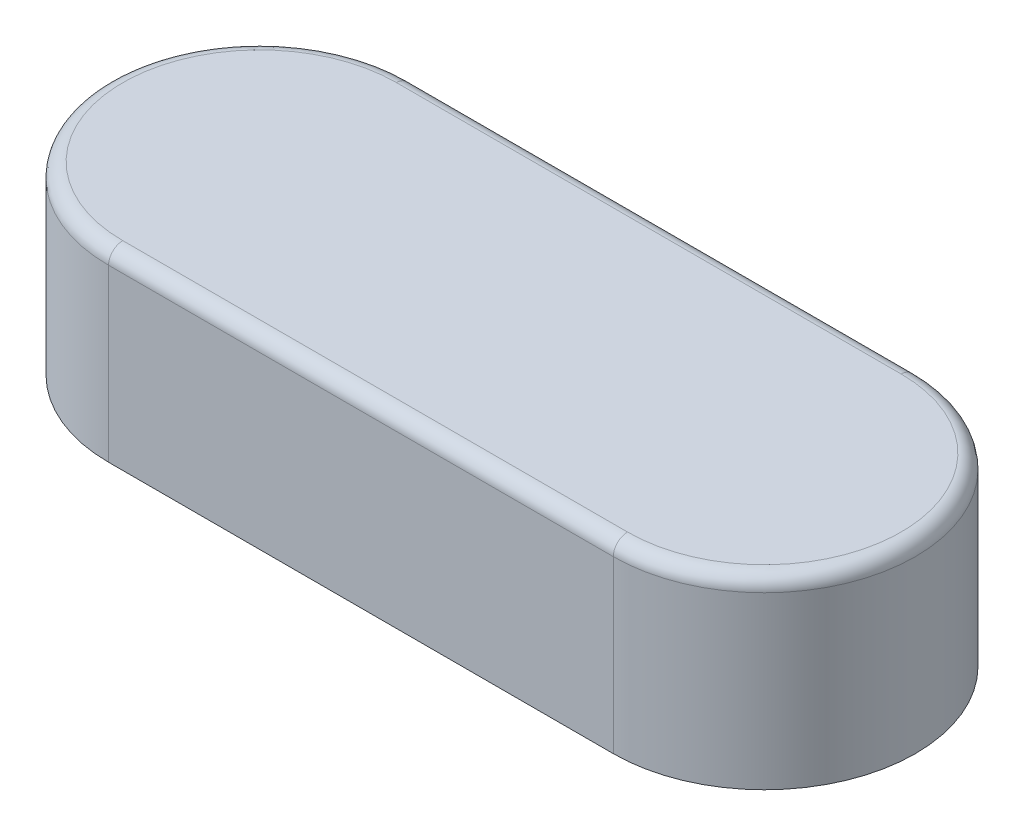
ISO-10303-21;
HEADER;
FILE_DESCRIPTION(('STEP AP214'),'2;1');
FILE_NAME('part.step','',(''),(''),'','','');
FILE_SCHEMA(('AUTOMOTIVE_DESIGN { 1 0 10303 214 1 1 1 1 }'));
ENDSEC;
DATA;
#1=APPLICATION_CONTEXT('core data for automotive mechanical design processes');
#2=APPLICATION_PROTOCOL_DEFINITION('international standard','automotive_design',2000,#1);
#3=PRODUCT_CONTEXT('',#1,'mechanical');
#4=PRODUCT('Part','Part','',(#3));
#5=PRODUCT_RELATED_PRODUCT_CATEGORY('part','',(#4));
#6=PRODUCT_DEFINITION_FORMATION('','',#4);
#7=PRODUCT_DEFINITION_CONTEXT('part definition',#1,'design');
#8=PRODUCT_DEFINITION('design','',#6,#7);
#9=PRODUCT_DEFINITION_SHAPE('','',#8);
#10=(LENGTH_UNIT() NAMED_UNIT(*) SI_UNIT(.MILLI.,.METRE.));
#11=(NAMED_UNIT(*) PLANE_ANGLE_UNIT() SI_UNIT($,.RADIAN.));
#12=(NAMED_UNIT(*) SI_UNIT($,.STERADIAN.) SOLID_ANGLE_UNIT());
#13=UNCERTAINTY_MEASURE_WITH_UNIT(LENGTH_MEASURE(1.E-05),#10,'distance_accuracy_value','');
#14=(GEOMETRIC_REPRESENTATION_CONTEXT(3) GLOBAL_UNCERTAINTY_ASSIGNED_CONTEXT((#13)) GLOBAL_UNIT_ASSIGNED_CONTEXT((#10,
#11,#12)) REPRESENTATION_CONTEXT('',''));
#15=CARTESIAN_POINT('',(0.,0.,0.));
#16=DIRECTION('',(0.,0.,1.));
#17=DIRECTION('',(1.,0.,0.));
#18=AXIS2_PLACEMENT_3D('',#15,#16,#17);
#19=CARTESIAN_POINT('',(0.,-15.,0.));
#20=DIRECTION('',(0.,1.,0.));
#21=DIRECTION('',(0.,0.,1.));
#22=AXIS2_PLACEMENT_3D('',#19,#20,#21);
#23=PLANE('',#22);
#24=CARTESIAN_POINT('',(0.,-15.,-37.5));
#25=DIRECTION('',(0.,1.,0.));
#26=DIRECTION('',(0.,0.,1.));
#27=AXIS2_PLACEMENT_3D('',#24,#25,#26);
#28=CIRCLE('',#27,2.1);
#29=CARTESIAN_POINT('',(0.,-15.,-35.4));
#30=VERTEX_POINT('',#29);
#31=EDGE_CURVE('E374',#30,#30,#28,.F.);
#32=ORIENTED_EDGE('',*,*,#31,.F.);
#33=EDGE_LOOP('',(#32));
#34=FACE_BOUND('',#33,.T.);
#35=CARTESIAN_POINT('',(37.5,-15.,0.));
#36=DIRECTION('',(0.,1.,0.));
#37=DIRECTION('',(0.,0.,1.));
#38=AXIS2_PLACEMENT_3D('',#35,#36,#37);
#39=CIRCLE('',#38,2.1);
#40=CARTESIAN_POINT('',(37.5,-15.,2.1));
#41=VERTEX_POINT('',#40);
#42=EDGE_CURVE('E403',#41,#41,#39,.F.);
#43=ORIENTED_EDGE('',*,*,#42,.F.);
#44=EDGE_LOOP('',(#43));
#45=FACE_BOUND('',#44,.T.);
#46=CARTESIAN_POINT('',(0.,-15.,37.5));
#47=DIRECTION('',(0.,1.,0.));
#48=DIRECTION('',(0.,0.,1.));
#49=AXIS2_PLACEMENT_3D('',#46,#47,#48);
#50=CIRCLE('',#49,2.1);
#51=CARTESIAN_POINT('',(0.,-15.,39.6));
#52=VERTEX_POINT('',#51);
#53=EDGE_CURVE('E400',#52,#52,#50,.F.);
#54=ORIENTED_EDGE('',*,*,#53,.F.);
#55=EDGE_LOOP('',(#54));
#56=FACE_BOUND('',#55,.T.);
#57=CARTESIAN_POINT('',(-142.,-15.,37.5));
#58=DIRECTION('',(0.,1.,0.));
#59=DIRECTION('',(0.,0.,1.));
#60=AXIS2_PLACEMENT_3D('',#57,#58,#59);
#61=CIRCLE('',#60,2.09999999999999);
#62=CARTESIAN_POINT('',(-142.,-15.,39.6));
#63=VERTEX_POINT('',#62);
#64=EDGE_CURVE('E397',#63,#63,#61,.F.);
#65=ORIENTED_EDGE('',*,*,#64,.F.);
#66=EDGE_LOOP('',(#65));
#67=FACE_BOUND('',#66,.T.);
#68=CARTESIAN_POINT('',(-179.5,-15.,0.));
#69=DIRECTION('',(0.,1.,0.));
#70=DIRECTION('',(0.,0.,1.));
#71=AXIS2_PLACEMENT_3D('',#68,#69,#70);
#72=CIRCLE('',#71,2.09999999999999);
#73=CARTESIAN_POINT('',(-179.5,-15.,2.09999999999999));
#74=VERTEX_POINT('',#73);
#75=EDGE_CURVE('E394',#74,#74,#72,.F.);
#76=ORIENTED_EDGE('',*,*,#75,.F.);
#77=EDGE_LOOP('',(#76));
#78=FACE_BOUND('',#77,.T.);
#79=CARTESIAN_POINT('',(-142.,-15.,-37.5));
#80=DIRECTION('',(0.,1.,0.));
#81=DIRECTION('',(0.,0.,1.));
#82=AXIS2_PLACEMENT_3D('',#79,#80,#81);
#83=CIRCLE('',#82,2.09999999999999);
#84=CARTESIAN_POINT('',(-142.,-15.,-35.4));
#85=VERTEX_POINT('',#84);
#86=EDGE_CURVE('E369',#85,#85,#83,.F.);
#87=ORIENTED_EDGE('',*,*,#86,.F.);
#88=EDGE_LOOP('',(#87));
#89=FACE_BOUND('',#88,.T.);
#90=CARTESIAN_POINT('',(-142.,-15.,0.));
#91=DIRECTION('',(0.,1.,0.));
#92=DIRECTION('',(0.,0.,1.));
#93=AXIS2_PLACEMENT_3D('',#90,#91,#92);
#94=CIRCLE('',#93,42.5);
#95=CARTESIAN_POINT('',(-142.,-15.,-42.5));
#96=VERTEX_POINT('',#95);
#97=CARTESIAN_POINT('',(-142.,-15.,42.5));
#98=VERTEX_POINT('',#97);
#99=EDGE_CURVE('E370',#96,#98,#94,.T.);
#100=ORIENTED_EDGE('',*,*,#99,.F.);
#101=DIRECTION('',(1.,0.,0.));
#102=VECTOR('',#101,1.);
#103=CARTESIAN_POINT('',(0.,-15.,-42.5));
#104=LINE('',#103,#102);
#105=CARTESIAN_POINT('',(0.,-15.,-42.5));
#106=VERTEX_POINT('',#105);
#107=EDGE_CURVE('E380',#96,#106,#104,.T.);
#108=ORIENTED_EDGE('',*,*,#107,.T.);
#109=CARTESIAN_POINT('',(0.,-15.,0.));
#110=DIRECTION('',(0.,1.,0.));
#111=DIRECTION('',(0.,0.,1.));
#112=AXIS2_PLACEMENT_3D('',#109,#110,#111);
#113=CIRCLE('',#112,42.5);
#114=CARTESIAN_POINT('',(0.,-15.,42.5));
#115=VERTEX_POINT('',#114);
#116=EDGE_CURVE('E377',#115,#106,#113,.T.);
#117=ORIENTED_EDGE('',*,*,#116,.F.);
#118=DIRECTION('',(1.,0.,0.));
#119=VECTOR('',#118,1.);
#120=CARTESIAN_POINT('',(0.,-15.,42.5));
#121=LINE('',#120,#119);
#122=EDGE_CURVE('E373',#98,#115,#121,.T.);
#123=ORIENTED_EDGE('',*,*,#122,.F.);
#124=EDGE_LOOP('',(#100,#108,#117,#123));
#125=FACE_BOUND('',#124,.T.);
#126=CARTESIAN_POINT('',(-142.,-15.,-37.5));
#127=DIRECTION('',(0.,1.,0.));
#128=DIRECTION('',(0.,0.,1.));
#129=AXIS2_PLACEMENT_3D('',#126,#127,#128);
#130=CIRCLE('',#129,5.09999999999999);
#131=CARTESIAN_POINT('',(-137.308518357704,-15.,-39.5));
#132=VERTEX_POINT('',#131);
#133=CARTESIAN_POINT('',(-146.806011234092,-15.,-39.2065333333334));
#134=VERTEX_POINT('',#133);
#135=EDGE_CURVE('E297',#132,#134,#130,.F.);
#136=ORIENTED_EDGE('',*,*,#135,.T.);
#137=CARTESIAN_POINT('',(-142.,-15.,0.));
#138=DIRECTION('',(0.,1.,0.));
#139=DIRECTION('',(0.,0.,1.));
#140=AXIS2_PLACEMENT_3D('',#137,#138,#139);
#141=CIRCLE('',#140,39.5);
#142=CARTESIAN_POINT('',(-181.206533333333,-15.,-4.80601123409235));
#143=VERTEX_POINT('',#142);
#144=EDGE_CURVE('E255',#134,#143,#141,.T.);
#145=ORIENTED_EDGE('',*,*,#144,.T.);
#146=CARTESIAN_POINT('',(-179.5,-15.,0.));
#147=DIRECTION('',(0.,1.,0.));
#148=DIRECTION('',(0.,0.,1.));
#149=AXIS2_PLACEMENT_3D('',#146,#147,#148);
#150=CIRCLE('',#149,5.09999999999999);
#151=CARTESIAN_POINT('',(-181.206533333333,-15.,4.80601123409235));
#152=VERTEX_POINT('',#151);
#153=EDGE_CURVE('E291',#143,#152,#150,.F.);
#154=ORIENTED_EDGE('',*,*,#153,.T.);
#155=CARTESIAN_POINT('',(-146.806011234092,-15.,39.2065333333334));
#156=VERTEX_POINT('',#155);
#157=EDGE_CURVE('E52',#152,#156,#141,.T.);
#158=ORIENTED_EDGE('',*,*,#157,.T.);
#159=CARTESIAN_POINT('',(-142.,-15.,37.5));
#160=DIRECTION('',(0.,1.,0.));
#161=DIRECTION('',(0.,0.,1.));
#162=AXIS2_PLACEMENT_3D('',#159,#160,#161);
#163=CIRCLE('',#162,5.09999999999999);
#164=CARTESIAN_POINT('',(-137.308518357704,-15.,39.5));
#165=VERTEX_POINT('',#164);
#166=EDGE_CURVE('E285',#156,#165,#163,.F.);
#167=ORIENTED_EDGE('',*,*,#166,.T.);
#168=DIRECTION('',(1.,0.,0.));
#169=VECTOR('',#168,1.);
#170=CARTESIAN_POINT('',(0.,-15.,39.5));
#171=LINE('',#170,#169);
#172=CARTESIAN_POINT('',(-4.69148164229596,-15.,39.5));
#173=VERTEX_POINT('',#172);
#174=EDGE_CURVE('E265',#165,#173,#171,.T.);
#175=ORIENTED_EDGE('',*,*,#174,.T.);
#176=CARTESIAN_POINT('',(0.,-15.,37.5));
#177=DIRECTION('',(0.,1.,0.));
#178=DIRECTION('',(0.,0.,1.));
#179=AXIS2_PLACEMENT_3D('',#176,#177,#178);
#180=CIRCLE('',#179,5.1);
#181=CARTESIAN_POINT('',(4.80601123409239,-15.,39.2065333333333));
#182=VERTEX_POINT('',#181);
#183=EDGE_CURVE('E279',#173,#182,#180,.F.);
#184=ORIENTED_EDGE('',*,*,#183,.T.);
#185=CARTESIAN_POINT('',(0.,-15.,0.));
#186=DIRECTION('',(0.,1.,0.));
#187=DIRECTION('',(0.,0.,1.));
#188=AXIS2_PLACEMENT_3D('',#185,#186,#187);
#189=CIRCLE('',#188,39.5);
#190=CARTESIAN_POINT('',(39.2065333333333,-15.,4.80601123409238));
#191=VERTEX_POINT('',#190);
#192=EDGE_CURVE('E262',#182,#191,#189,.T.);
#193=ORIENTED_EDGE('',*,*,#192,.T.);
#194=CARTESIAN_POINT('',(37.5,-15.,0.));
#195=DIRECTION('',(0.,1.,0.));
#196=DIRECTION('',(0.,0.,1.));
#197=AXIS2_PLACEMENT_3D('',#194,#195,#196);
#198=CIRCLE('',#197,5.1);
#199=CARTESIAN_POINT('',(39.2065333333333,-15.,-4.80601123409238));
#200=VERTEX_POINT('',#199);
#201=EDGE_CURVE('E273',#191,#200,#198,.F.);
#202=ORIENTED_EDGE('',*,*,#201,.T.);
#203=CARTESIAN_POINT('',(4.80601123409239,-15.,-39.2065333333333));
#204=VERTEX_POINT('',#203);
#205=EDGE_CURVE('E261',#200,#204,#189,.T.);
#206=ORIENTED_EDGE('',*,*,#205,.T.);
#207=CARTESIAN_POINT('',(0.,-15.,-37.5));
#208=DIRECTION('',(0.,1.,0.));
#209=DIRECTION('',(0.,0.,1.));
#210=AXIS2_PLACEMENT_3D('',#207,#208,#209);
#211=CIRCLE('',#210,5.1);
#212=CARTESIAN_POINT('',(-4.69148164229596,-15.,-39.5));
#213=VERTEX_POINT('',#212);
#214=EDGE_CURVE('E258',#204,#213,#211,.F.);
#215=ORIENTED_EDGE('',*,*,#214,.T.);
#216=DIRECTION('',(1.,0.,0.));
#217=VECTOR('',#216,1.);
#218=CARTESIAN_POINT('',(0.,-15.,-39.5));
#219=LINE('',#218,#217);
#220=EDGE_CURVE('E218',#132,#213,#219,.T.);
#221=ORIENTED_EDGE('',*,*,#220,.F.);
#222=EDGE_LOOP('',(#136,#145,#154,#158,#167,#175,#184,#193,#202,#206,#215,#221));
#223=FACE_BOUND('',#222,.T.);
#224=ADVANCED_FACE('F35',(#34,#45,#56,#67,#78,#89,#125,#223),#23,.F.);
#225=CARTESIAN_POINT('',(-142.,37.,0.));
#226=DIRECTION('',(0.,-1.,0.));
#227=DIRECTION('',(0.,0.,-1.));
#228=AXIS2_PLACEMENT_3D('',#225,#226,#227);
#229=CYLINDRICAL_SURFACE('',#228,42.5);
#230=DIRECTION('',(0.,-1.,0.));
#231=VECTOR('',#230,1.);
#232=CARTESIAN_POINT('',(-142.,37.,42.5));
#233=LINE('',#232,#231);
#234=CARTESIAN_POINT('',(-142.,33.,42.5));
#235=VERTEX_POINT('',#234);
#236=EDGE_CURVE('E389',#235,#98,#233,.T.);
#237=ORIENTED_EDGE('',*,*,#236,.F.);
#238=CARTESIAN_POINT('',(-142.,33.,0.));
#239=DIRECTION('',(0.,1.,0.));
#240=DIRECTION('',(0.,0.,1.));
#241=AXIS2_PLACEMENT_3D('',#238,#239,#240);
#242=CIRCLE('',#241,42.5);
#243=CARTESIAN_POINT('',(-142.,33.,-42.5));
#244=VERTEX_POINT('',#243);
#245=EDGE_CURVE('E11',#235,#244,#242,.F.);
#246=ORIENTED_EDGE('',*,*,#245,.T.);
#247=DIRECTION('',(0.,-1.,0.));
#248=VECTOR('',#247,1.);
#249=CARTESIAN_POINT('',(-142.,37.,-42.5));
#250=LINE('',#249,#248);
#251=EDGE_CURVE('E383',#244,#96,#250,.T.);
#252=ORIENTED_EDGE('',*,*,#251,.T.);
#253=ORIENTED_EDGE('',*,*,#99,.T.);
#254=EDGE_LOOP('',(#237,#246,#252,#253));
#255=FACE_BOUND('',#254,.T.);
#256=ADVANCED_FACE('F461',(#255),#229,.T.);
#257=CARTESIAN_POINT('',(0.,37.,42.5));
#258=DIRECTION('',(0.,0.,-1.));
#259=DIRECTION('',(-1.,0.,0.));
#260=AXIS2_PLACEMENT_3D('',#257,#258,#259);
#261=PLANE('',#260);
#262=DIRECTION('',(0.,-1.,0.));
#263=VECTOR('',#262,1.);
#264=CARTESIAN_POINT('',(0.,37.,42.5));
#265=LINE('',#264,#263);
#266=CARTESIAN_POINT('',(0.,33.,42.5));
#267=VERTEX_POINT('',#266);
#268=EDGE_CURVE('E387',#267,#115,#265,.T.);
#269=ORIENTED_EDGE('',*,*,#268,.F.);
#270=DIRECTION('',(1.,0.,0.));
#271=VECTOR('',#270,1.);
#272=CARTESIAN_POINT('',(-142.,33.,42.5));
#273=LINE('',#272,#271);
#274=EDGE_CURVE('E44',#267,#235,#273,.F.);
#275=ORIENTED_EDGE('',*,*,#274,.T.);
#276=ORIENTED_EDGE('',*,*,#236,.T.);
#277=ORIENTED_EDGE('',*,*,#122,.T.);
#278=EDGE_LOOP('',(#269,#275,#276,#277));
#279=FACE_BOUND('',#278,.T.);
#280=ADVANCED_FACE('F459',(#279),#261,.F.);
#281=CARTESIAN_POINT('',(0.,37.,0.));
#282=DIRECTION('',(0.,-1.,0.));
#283=DIRECTION('',(0.,0.,-1.));
#284=AXIS2_PLACEMENT_3D('',#281,#282,#283);
#285=CYLINDRICAL_SURFACE('',#284,42.5);
#286=DIRECTION('',(0.,-1.,0.));
#287=VECTOR('',#286,1.);
#288=CARTESIAN_POINT('',(0.,37.,-42.5));
#289=LINE('',#288,#287);
#290=CARTESIAN_POINT('',(0.,33.,-42.5));
#291=VERTEX_POINT('',#290);
#292=EDGE_CURVE('E385',#291,#106,#289,.T.);
#293=ORIENTED_EDGE('',*,*,#292,.F.);
#294=CARTESIAN_POINT('',(0.,33.,0.));
#295=DIRECTION('',(0.,1.,0.));
#296=DIRECTION('',(0.,0.,1.));
#297=AXIS2_PLACEMENT_3D('',#294,#295,#296);
#298=CIRCLE('',#297,42.5);
#299=EDGE_CURVE('E419',#291,#267,#298,.F.);
#300=ORIENTED_EDGE('',*,*,#299,.T.);
#301=ORIENTED_EDGE('',*,*,#268,.T.);
#302=ORIENTED_EDGE('',*,*,#116,.T.);
#303=EDGE_LOOP('',(#293,#300,#301,#302));
#304=FACE_BOUND('',#303,.T.);
#305=ADVANCED_FACE('F453',(#304),#285,.T.);
#306=CARTESIAN_POINT('',(0.,37.,-42.5));
#307=DIRECTION('',(0.,0.,-1.));
#308=DIRECTION('',(-1.,0.,0.));
#309=AXIS2_PLACEMENT_3D('',#306,#307,#308);
#310=PLANE('',#309);
#311=ORIENTED_EDGE('',*,*,#251,.F.);
#312=DIRECTION('',(1.,0.,0.));
#313=VECTOR('',#312,1.);
#314=CARTESIAN_POINT('',(0.,33.,-42.5));
#315=LINE('',#314,#313);
#316=EDGE_CURVE('E391',#244,#291,#315,.T.);
#317=ORIENTED_EDGE('',*,*,#316,.T.);
#318=ORIENTED_EDGE('',*,*,#292,.T.);
#319=ORIENTED_EDGE('',*,*,#107,.F.);
#320=EDGE_LOOP('',(#311,#317,#318,#319));
#321=FACE_BOUND('',#320,.T.);
#322=ADVANCED_FACE('F451',(#321),#310,.T.);
#323=CARTESIAN_POINT('',(0.,37.,0.));
#324=DIRECTION('',(0.,1.,0.));
#325=DIRECTION('',(0.,0.,1.));
#326=AXIS2_PLACEMENT_3D('',#323,#324,#325);
#327=PLANE('',#326);
#328=CARTESIAN_POINT('',(0.,37.,0.));
#329=DIRECTION('',(0.,1.,0.));
#330=DIRECTION('',(0.,0.,1.));
#331=AXIS2_PLACEMENT_3D('',#328,#329,#330);
#332=CIRCLE('',#331,38.5);
#333=CARTESIAN_POINT('',(0.,37.,38.5));
#334=VERTEX_POINT('',#333);
#335=CARTESIAN_POINT('',(0.,37.,-38.5));
#336=VERTEX_POINT('',#335);
#337=EDGE_CURVE('E414',#334,#336,#332,.T.);
#338=ORIENTED_EDGE('',*,*,#337,.T.);
#339=DIRECTION('',(1.,0.,0.));
#340=VECTOR('',#339,1.);
#341=CARTESIAN_POINT('',(0.,37.,-38.5));
#342=LINE('',#341,#340);
#343=CARTESIAN_POINT('',(-142.,37.,-38.5));
#344=VERTEX_POINT('',#343);
#345=EDGE_CURVE('E416',#336,#344,#342,.F.);
#346=ORIENTED_EDGE('',*,*,#345,.T.);
#347=CARTESIAN_POINT('',(-142.,37.,0.));
#348=DIRECTION('',(0.,1.,0.));
#349=DIRECTION('',(0.,0.,1.));
#350=AXIS2_PLACEMENT_3D('',#347,#348,#349);
#351=CIRCLE('',#350,38.5);
#352=CARTESIAN_POINT('',(-142.,37.,38.5));
#353=VERTEX_POINT('',#352);
#354=EDGE_CURVE('E410',#344,#353,#351,.T.);
#355=ORIENTED_EDGE('',*,*,#354,.T.);
#356=DIRECTION('',(1.,0.,0.));
#357=VECTOR('',#356,1.);
#358=CARTESIAN_POINT('',(0.,37.,38.5));
#359=LINE('',#358,#357);
#360=EDGE_CURVE('E412',#353,#334,#359,.T.);
#361=ORIENTED_EDGE('',*,*,#360,.T.);
#362=EDGE_LOOP('',(#338,#346,#355,#361));
#363=FACE_BOUND('',#362,.T.);
#364=ADVANCED_FACE('F440',(#363),#327,.T.);
#365=CARTESIAN_POINT('',(-142.,10.,-37.5));
#366=DIRECTION('',(0.,-1.,0.));
#367=DIRECTION('',(0.,0.,-1.));
#368=AXIS2_PLACEMENT_3D('',#365,#366,#367);
#369=CYLINDRICAL_SURFACE('',#368,2.09999999999999);
#370=CARTESIAN_POINT('',(-142.,10.,-37.5));
#371=DIRECTION('',(0.,1.,0.));
#372=DIRECTION('',(0.,0.,1.));
#373=AXIS2_PLACEMENT_3D('',#370,#371,#372);
#374=CIRCLE('',#373,2.09999999999999);
#375=CARTESIAN_POINT('',(-142.,10.,-35.4));
#376=VERTEX_POINT('',#375);
#377=EDGE_CURVE('E354',#376,#376,#374,.T.);
#378=ORIENTED_EDGE('',*,*,#377,.T.);
#379=EDGE_LOOP('',(#378));
#380=FACE_BOUND('',#379,.T.);
#381=ORIENTED_EDGE('',*,*,#86,.T.);
#382=EDGE_LOOP('',(#381));
#383=FACE_BOUND('',#382,.T.);
#384=ADVANCED_FACE('F503',(#380,#383),#369,.F.);
#385=CARTESIAN_POINT('',(-142.,10.,-37.5));
#386=DIRECTION('',(0.,1.,0.));
#387=DIRECTION('',(0.,0.,1.));
#388=AXIS2_PLACEMENT_3D('',#385,#386,#387);
#389=PLANE('',#388);
#390=ORIENTED_EDGE('',*,*,#377,.F.);
#391=EDGE_LOOP('',(#390));
#392=FACE_BOUND('',#391,.T.);
#393=ADVANCED_FACE('F499',(#392),#389,.F.);
#394=CARTESIAN_POINT('',(-179.5,10.,0.));
#395=DIRECTION('',(0.,-1.,0.));
#396=DIRECTION('',(0.,0.,-1.));
#397=AXIS2_PLACEMENT_3D('',#394,#395,#396);
#398=CYLINDRICAL_SURFACE('',#397,2.09999999999999);
#399=CARTESIAN_POINT('',(-179.5,10.,0.));
#400=DIRECTION('',(0.,1.,0.));
#401=DIRECTION('',(0.,0.,1.));
#402=AXIS2_PLACEMENT_3D('',#399,#400,#401);
#403=CIRCLE('',#402,2.09999999999999);
#404=CARTESIAN_POINT('',(-179.5,10.,2.09999999999999));
#405=VERTEX_POINT('',#404);
#406=EDGE_CURVE('E351',#405,#405,#403,.T.);
#407=ORIENTED_EDGE('',*,*,#406,.T.);
#408=EDGE_LOOP('',(#407));
#409=FACE_BOUND('',#408,.T.);
#410=ORIENTED_EDGE('',*,*,#75,.T.);
#411=EDGE_LOOP('',(#410));
#412=FACE_BOUND('',#411,.T.);
#413=ADVANCED_FACE('F502',(#409,#412),#398,.F.);
#414=CARTESIAN_POINT('',(-179.5,10.,0.));
#415=DIRECTION('',(0.,1.,0.));
#416=DIRECTION('',(0.,0.,1.));
#417=AXIS2_PLACEMENT_3D('',#414,#415,#416);
#418=PLANE('',#417);
#419=ORIENTED_EDGE('',*,*,#406,.F.);
#420=EDGE_LOOP('',(#419));
#421=FACE_BOUND('',#420,.T.);
#422=ADVANCED_FACE('F538',(#421),#418,.F.);
#423=CARTESIAN_POINT('',(-142.,10.,37.5));
#424=DIRECTION('',(0.,-1.,0.));
#425=DIRECTION('',(0.,0.,-1.));
#426=AXIS2_PLACEMENT_3D('',#423,#424,#425);
#427=CYLINDRICAL_SURFACE('',#426,2.09999999999999);
#428=CARTESIAN_POINT('',(-142.,10.,37.5));
#429=DIRECTION('',(0.,1.,0.));
#430=DIRECTION('',(0.,0.,1.));
#431=AXIS2_PLACEMENT_3D('',#428,#429,#430);
#432=CIRCLE('',#431,2.09999999999999);
#433=CARTESIAN_POINT('',(-142.,10.,39.6));
#434=VERTEX_POINT('',#433);
#435=EDGE_CURVE('E355',#434,#434,#432,.T.);
#436=ORIENTED_EDGE('',*,*,#435,.T.);
#437=EDGE_LOOP('',(#436));
#438=FACE_BOUND('',#437,.T.);
#439=ORIENTED_EDGE('',*,*,#64,.T.);
#440=EDGE_LOOP('',(#439));
#441=FACE_BOUND('',#440,.T.);
#442=ADVANCED_FACE('F546',(#438,#441),#427,.F.);
#443=CARTESIAN_POINT('',(-142.,10.,37.5));
#444=DIRECTION('',(0.,1.,0.));
#445=DIRECTION('',(0.,0.,1.));
#446=AXIS2_PLACEMENT_3D('',#443,#444,#445);
#447=PLANE('',#446);
#448=ORIENTED_EDGE('',*,*,#435,.F.);
#449=EDGE_LOOP('',(#448));
#450=FACE_BOUND('',#449,.T.);
#451=ADVANCED_FACE('F554',(#450),#447,.F.);
#452=CARTESIAN_POINT('',(0.,10.,37.5));
#453=DIRECTION('',(0.,-1.,0.));
#454=DIRECTION('',(0.,0.,-1.));
#455=AXIS2_PLACEMENT_3D('',#452,#453,#454);
#456=CYLINDRICAL_SURFACE('',#455,2.1);
#457=CARTESIAN_POINT('',(0.,10.,37.5));
#458=DIRECTION('',(0.,1.,0.));
#459=DIRECTION('',(0.,0.,1.));
#460=AXIS2_PLACEMENT_3D('',#457,#458,#459);
#461=CIRCLE('',#460,2.1);
#462=CARTESIAN_POINT('',(0.,10.,39.6));
#463=VERTEX_POINT('',#462);
#464=EDGE_CURVE('E358',#463,#463,#461,.T.);
#465=ORIENTED_EDGE('',*,*,#464,.T.);
#466=EDGE_LOOP('',(#465));
#467=FACE_BOUND('',#466,.T.);
#468=ORIENTED_EDGE('',*,*,#53,.T.);
#469=EDGE_LOOP('',(#468));
#470=FACE_BOUND('',#469,.T.);
#471=ADVANCED_FACE('F562',(#467,#470),#456,.F.);
#472=CARTESIAN_POINT('',(0.,10.,37.5));
#473=DIRECTION('',(0.,1.,0.));
#474=DIRECTION('',(0.,0.,1.));
#475=AXIS2_PLACEMENT_3D('',#472,#473,#474);
#476=PLANE('',#475);
#477=ORIENTED_EDGE('',*,*,#464,.F.);
#478=EDGE_LOOP('',(#477));
#479=FACE_BOUND('',#478,.T.);
#480=ADVANCED_FACE('F570',(#479),#476,.F.);
#481=CARTESIAN_POINT('',(37.5,10.,0.));
#482=DIRECTION('',(0.,-1.,0.));
#483=DIRECTION('',(0.,0.,-1.));
#484=AXIS2_PLACEMENT_3D('',#481,#482,#483);
#485=CYLINDRICAL_SURFACE('',#484,2.1);
#486=CARTESIAN_POINT('',(37.5,10.,0.));
#487=DIRECTION('',(0.,1.,0.));
#488=DIRECTION('',(0.,0.,1.));
#489=AXIS2_PLACEMENT_3D('',#486,#487,#488);
#490=CIRCLE('',#489,2.1);
#491=CARTESIAN_POINT('',(37.5,10.,2.1));
#492=VERTEX_POINT('',#491);
#493=EDGE_CURVE('E361',#492,#492,#490,.T.);
#494=ORIENTED_EDGE('',*,*,#493,.T.);
#495=EDGE_LOOP('',(#494));
#496=FACE_BOUND('',#495,.T.);
#497=ORIENTED_EDGE('',*,*,#42,.T.);
#498=EDGE_LOOP('',(#497));
#499=FACE_BOUND('',#498,.T.);
#500=ADVANCED_FACE('F496',(#496,#499),#485,.F.);
#501=CARTESIAN_POINT('',(37.5,10.,0.));
#502=DIRECTION('',(0.,1.,0.));
#503=DIRECTION('',(0.,0.,1.));
#504=AXIS2_PLACEMENT_3D('',#501,#502,#503);
#505=PLANE('',#504);
#506=ORIENTED_EDGE('',*,*,#493,.F.);
#507=EDGE_LOOP('',(#506));
#508=FACE_BOUND('',#507,.T.);
#509=ADVANCED_FACE('F491',(#508),#505,.F.);
#510=CARTESIAN_POINT('',(0.,10.,-37.5));
#511=DIRECTION('',(0.,-1.,0.));
#512=DIRECTION('',(0.,0.,-1.));
#513=AXIS2_PLACEMENT_3D('',#510,#511,#512);
#514=CYLINDRICAL_SURFACE('',#513,2.1);
#515=CARTESIAN_POINT('',(0.,10.,-37.5));
#516=DIRECTION('',(0.,1.,0.));
#517=DIRECTION('',(0.,0.,1.));
#518=AXIS2_PLACEMENT_3D('',#515,#516,#517);
#519=CIRCLE('',#518,2.1);
#520=CARTESIAN_POINT('',(0.,10.,-35.4));
#521=VERTEX_POINT('',#520);
#522=EDGE_CURVE('E364',#521,#521,#519,.T.);
#523=ORIENTED_EDGE('',*,*,#522,.T.);
#524=EDGE_LOOP('',(#523));
#525=FACE_BOUND('',#524,.T.);
#526=ORIENTED_EDGE('',*,*,#31,.T.);
#527=EDGE_LOOP('',(#526));
#528=FACE_BOUND('',#527,.T.);
#529=ADVANCED_FACE('F485',(#525,#528),#514,.F.);
#530=CARTESIAN_POINT('',(0.,10.,-37.5));
#531=DIRECTION('',(0.,1.,0.));
#532=DIRECTION('',(0.,0.,1.));
#533=AXIS2_PLACEMENT_3D('',#530,#531,#532);
#534=PLANE('',#533);
#535=ORIENTED_EDGE('',*,*,#522,.F.);
#536=EDGE_LOOP('',(#535));
#537=FACE_BOUND('',#536,.T.);
#538=ADVANCED_FACE('F481',(#537),#534,.F.);
#539=CARTESIAN_POINT('',(0.,33.,38.5));
#540=DIRECTION('',(-1.,0.,0.));
#541=DIRECTION('',(0.,0.,1.));
#542=AXIS2_PLACEMENT_3D('',#539,#540,#541);
#543=CYLINDRICAL_SURFACE('',#542,4.);
#544=CARTESIAN_POINT('',(0.,33.,38.5));
#545=DIRECTION('',(1.,0.,0.));
#546=DIRECTION('',(0.,0.,-1.));
#547=AXIS2_PLACEMENT_3D('',#544,#545,#546);
#548=CIRCLE('',#547,4.);
#549=EDGE_CURVE('E424',#334,#267,#548,.T.);
#550=ORIENTED_EDGE('',*,*,#549,.F.);
#551=ORIENTED_EDGE('',*,*,#360,.F.);
#552=CARTESIAN_POINT('',(-142.,33.,38.5));
#553=DIRECTION('',(-1.,0.,0.));
#554=DIRECTION('',(0.,0.,1.));
#555=AXIS2_PLACEMENT_3D('',#552,#553,#554);
#556=CIRCLE('',#555,4.);
#557=EDGE_CURVE('E39',#235,#353,#556,.T.);
#558=ORIENTED_EDGE('',*,*,#557,.F.);
#559=ORIENTED_EDGE('',*,*,#274,.F.);
#560=EDGE_LOOP('',(#550,#551,#558,#559));
#561=FACE_BOUND('',#560,.T.);
#562=ADVANCED_FACE('F37',(#561),#543,.T.);
#563=CARTESIAN_POINT('',(-142.,33.,0.));
#564=DIRECTION('',(0.,1.,0.));
#565=DIRECTION('',(0.,0.,1.));
#566=AXIS2_PLACEMENT_3D('',#563,#564,#565);
#567=TOROIDAL_SURFACE('',#566,38.5,4.);
#568=ORIENTED_EDGE('',*,*,#557,.T.);
#569=ORIENTED_EDGE('',*,*,#354,.F.);
#570=CARTESIAN_POINT('',(-142.,33.,-38.5));
#571=DIRECTION('',(1.,0.,0.));
#572=DIRECTION('',(0.,0.,-1.));
#573=AXIS2_PLACEMENT_3D('',#570,#571,#572);
#574=CIRCLE('',#573,4.);
#575=EDGE_CURVE('E423',#244,#344,#574,.T.);
#576=ORIENTED_EDGE('',*,*,#575,.F.);
#577=ORIENTED_EDGE('',*,*,#245,.F.);
#578=EDGE_LOOP('',(#568,#569,#576,#577));
#579=FACE_BOUND('',#578,.T.);
#580=ADVANCED_FACE('F435',(#579),#567,.T.);
#581=CARTESIAN_POINT('',(0.,33.,0.));
#582=DIRECTION('',(0.,1.,0.));
#583=DIRECTION('',(0.,0.,1.));
#584=AXIS2_PLACEMENT_3D('',#581,#582,#583);
#585=TOROIDAL_SURFACE('',#584,38.5,4.);
#586=ORIENTED_EDGE('',*,*,#549,.T.);
#587=ORIENTED_EDGE('',*,*,#299,.F.);
#588=CARTESIAN_POINT('',(0.,33.,-38.5));
#589=DIRECTION('',(-1.,0.,0.));
#590=DIRECTION('',(0.,0.,1.));
#591=AXIS2_PLACEMENT_3D('',#588,#589,#590);
#592=CIRCLE('',#591,4.);
#593=EDGE_CURVE('E350',#336,#291,#592,.T.);
#594=ORIENTED_EDGE('',*,*,#593,.F.);
#595=ORIENTED_EDGE('',*,*,#337,.F.);
#596=EDGE_LOOP('',(#586,#587,#594,#595));
#597=FACE_BOUND('',#596,.T.);
#598=ADVANCED_FACE('F446',(#597),#585,.T.);
#599=CARTESIAN_POINT('',(0.,33.,-38.5));
#600=DIRECTION('',(1.,0.,0.));
#601=DIRECTION('',(0.,0.,-1.));
#602=AXIS2_PLACEMENT_3D('',#599,#600,#601);
#603=CYLINDRICAL_SURFACE('',#602,4.);
#604=ORIENTED_EDGE('',*,*,#575,.T.);
#605=ORIENTED_EDGE('',*,*,#345,.F.);
#606=ORIENTED_EDGE('',*,*,#593,.T.);
#607=ORIENTED_EDGE('',*,*,#316,.F.);
#608=EDGE_LOOP('',(#604,#605,#606,#607));
#609=FACE_BOUND('',#608,.T.);
#610=ADVANCED_FACE('F444',(#609),#603,.T.);
#611=CARTESIAN_POINT('',(0.,13.,37.5));
#612=DIRECTION('',(0.,1.,0.));
#613=DIRECTION('',(0.,0.,1.));
#614=AXIS2_PLACEMENT_3D('',#611,#612,#613);
#615=PLANE('',#614);
#616=CARTESIAN_POINT('',(0.,13.,0.));
#617=DIRECTION('',(0.,1.,0.));
#618=DIRECTION('',(0.,0.,1.));
#619=AXIS2_PLACEMENT_3D('',#616,#617,#618);
#620=CIRCLE('',#619,39.5);
#621=CARTESIAN_POINT('',(0.,13.,39.5));
#622=VERTEX_POINT('',#621);
#623=CARTESIAN_POINT('',(4.80601123409239,13.,39.2065333333333));
#624=VERTEX_POINT('',#623);
#625=EDGE_CURVE('E342',#622,#624,#620,.T.);
#626=ORIENTED_EDGE('',*,*,#625,.T.);
#627=CARTESIAN_POINT('',(0.,13.,37.5));
#628=DIRECTION('',(0.,1.,0.));
#629=DIRECTION('',(0.,0.,1.));
#630=AXIS2_PLACEMENT_3D('',#627,#628,#629);
#631=CIRCLE('',#630,5.1);
#632=CARTESIAN_POINT('',(-4.69148164229596,13.,39.5));
#633=VERTEX_POINT('',#632);
#634=EDGE_CURVE('E276',#624,#633,#631,.T.);
#635=ORIENTED_EDGE('',*,*,#634,.T.);
#636=DIRECTION('',(1.,0.,0.));
#637=VECTOR('',#636,1.);
#638=CARTESIAN_POINT('',(0.,13.,39.5));
#639=LINE('',#638,#637);
#640=EDGE_CURVE('E340',#633,#622,#639,.T.);
#641=ORIENTED_EDGE('',*,*,#640,.T.);
#642=EDGE_LOOP('',(#626,#635,#641));
#643=FACE_BOUND('',#642,.T.);
#644=ADVANCED_FACE('F475',(#643),#615,.T.);
#645=CARTESIAN_POINT('',(-142.,13.,37.5));
#646=DIRECTION('',(0.,1.,0.));
#647=DIRECTION('',(0.,0.,1.));
#648=AXIS2_PLACEMENT_3D('',#645,#646,#647);
#649=PLANE('',#648);
#650=DIRECTION('',(1.,0.,0.));
#651=VECTOR('',#650,1.);
#652=CARTESIAN_POINT('',(0.,13.,39.5));
#653=LINE('',#652,#651);
#654=CARTESIAN_POINT('',(-142.,13.,39.5));
#655=VERTEX_POINT('',#654);
#656=CARTESIAN_POINT('',(-137.308518357704,13.,39.5));
#657=VERTEX_POINT('',#656);
#658=EDGE_CURVE('E337',#655,#657,#653,.T.);
#659=ORIENTED_EDGE('',*,*,#658,.T.);
#660=CARTESIAN_POINT('',(-142.,13.,37.5));
#661=DIRECTION('',(0.,1.,0.));
#662=DIRECTION('',(0.,0.,1.));
#663=AXIS2_PLACEMENT_3D('',#660,#661,#662);
#664=CIRCLE('',#663,5.09999999999999);
#665=CARTESIAN_POINT('',(-146.806011234092,13.,39.2065333333334));
#666=VERTEX_POINT('',#665);
#667=EDGE_CURVE('E282',#657,#666,#664,.T.);
#668=ORIENTED_EDGE('',*,*,#667,.T.);
#669=CARTESIAN_POINT('',(-142.,13.,0.));
#670=DIRECTION('',(0.,1.,0.));
#671=DIRECTION('',(0.,0.,1.));
#672=AXIS2_PLACEMENT_3D('',#669,#670,#671);
#673=CIRCLE('',#672,39.5);
#674=EDGE_CURVE('E331',#666,#655,#673,.T.);
#675=ORIENTED_EDGE('',*,*,#674,.T.);
#676=EDGE_LOOP('',(#659,#668,#675));
#677=FACE_BOUND('',#676,.T.);
#678=ADVANCED_FACE('F720',(#677),#649,.T.);
#679=CARTESIAN_POINT('',(0.,37.,-39.5));
#680=DIRECTION('',(0.,0.,-1.));
#681=DIRECTION('',(-1.,0.,0.));
#682=AXIS2_PLACEMENT_3D('',#679,#680,#681);
#683=PLANE('',#682);
#684=DIRECTION('',(1.,0.,0.));
#685=VECTOR('',#684,1.);
#686=CARTESIAN_POINT('',(0.,13.,-39.5));
#687=LINE('',#686,#685);
#688=CARTESIAN_POINT('',(-4.69148164229596,13.,-39.5));
#689=VERTEX_POINT('',#688);
#690=CARTESIAN_POINT('',(0.,13.,-39.5));
#691=VERTEX_POINT('',#690);
#692=EDGE_CURVE('E335',#689,#691,#687,.T.);
#693=ORIENTED_EDGE('',*,*,#692,.T.);
#694=DIRECTION('',(0.,1.,0.));
#695=VECTOR('',#694,1.);
#696=CARTESIAN_POINT('',(0.,37.,-39.5));
#697=LINE('',#696,#695);
#698=CARTESIAN_POINT('',(0.,33.,-39.5));
#699=VERTEX_POINT('',#698);
#700=EDGE_CURVE('E217',#699,#691,#697,.F.);
#701=ORIENTED_EDGE('',*,*,#700,.F.);
#702=DIRECTION('',(-1.,0.,0.));
#703=VECTOR('',#702,1.);
#704=CARTESIAN_POINT('',(0.,33.,-39.5));
#705=LINE('',#704,#703);
#706=CARTESIAN_POINT('',(-142.,33.,-39.5));
#707=VERTEX_POINT('',#706);
#708=EDGE_CURVE('E225',#707,#699,#705,.F.);
#709=ORIENTED_EDGE('',*,*,#708,.F.);
#710=DIRECTION('',(0.,-1.,0.));
#711=VECTOR('',#710,1.);
#712=CARTESIAN_POINT('',(-142.,37.,-39.5));
#713=LINE('',#712,#711);
#714=CARTESIAN_POINT('',(-142.,13.,-39.5));
#715=VERTEX_POINT('',#714);
#716=EDGE_CURVE('E210',#707,#715,#713,.T.);
#717=ORIENTED_EDGE('',*,*,#716,.T.);
#718=DIRECTION('',(-1.,0.,0.));
#719=VECTOR('',#718,1.);
#720=CARTESIAN_POINT('',(-142.,13.,-39.5));
#721=LINE('',#720,#719);
#722=CARTESIAN_POINT('',(-137.308518357704,13.,-39.5));
#723=VERTEX_POINT('',#722);
#724=EDGE_CURVE('E333',#723,#715,#721,.T.);
#725=ORIENTED_EDGE('',*,*,#724,.F.);
#726=DIRECTION('',(0.,-1.,0.));
#727=VECTOR('',#726,1.);
#728=CARTESIAN_POINT('',(-137.308518357704,10.,-39.5));
#729=LINE('',#728,#727);
#730=EDGE_CURVE('E303',#132,#723,#729,.F.);
#731=ORIENTED_EDGE('',*,*,#730,.F.);
#732=ORIENTED_EDGE('',*,*,#220,.T.);
#733=DIRECTION('',(0.,-1.,0.));
#734=VECTOR('',#733,1.);
#735=CARTESIAN_POINT('',(-4.69148164229596,10.,-39.5));
#736=LINE('',#735,#734);
#737=EDGE_CURVE('E322',#213,#689,#736,.F.);
#738=ORIENTED_EDGE('',*,*,#737,.T.);
#739=EDGE_LOOP('',(#693,#701,#709,#717,#725,#731,#732,#738));
#740=FACE_BOUND('',#739,.T.);
#741=ADVANCED_FACE('F233',(#740),#683,.F.);
#742=CARTESIAN_POINT('',(-142.,13.,-37.5));
#743=DIRECTION('',(0.,1.,0.));
#744=DIRECTION('',(0.,0.,1.));
#745=AXIS2_PLACEMENT_3D('',#742,#743,#744);
#746=PLANE('',#745);
#747=ORIENTED_EDGE('',*,*,#724,.T.);
#748=CARTESIAN_POINT('',(-142.,13.,0.));
#749=DIRECTION('',(0.,1.,0.));
#750=DIRECTION('',(0.,0.,1.));
#751=AXIS2_PLACEMENT_3D('',#748,#749,#750);
#752=CIRCLE('',#751,39.5);
#753=CARTESIAN_POINT('',(-146.806011234092,13.,-39.2065333333334));
#754=VERTEX_POINT('',#753);
#755=EDGE_CURVE('E213',#715,#754,#752,.T.);
#756=ORIENTED_EDGE('',*,*,#755,.T.);
#757=CARTESIAN_POINT('',(-142.,13.,-37.5));
#758=DIRECTION('',(0.,1.,0.));
#759=DIRECTION('',(0.,0.,1.));
#760=AXIS2_PLACEMENT_3D('',#757,#758,#759);
#761=CIRCLE('',#760,5.09999999999999);
#762=EDGE_CURVE('E294',#754,#723,#761,.T.);
#763=ORIENTED_EDGE('',*,*,#762,.T.);
#764=EDGE_LOOP('',(#747,#756,#763));
#765=FACE_BOUND('',#764,.T.);
#766=ADVANCED_FACE('F692',(#765),#746,.T.);
#767=CARTESIAN_POINT('',(-142.,37.,0.));
#768=DIRECTION('',(0.,-1.,0.));
#769=DIRECTION('',(0.,0.,-1.));
#770=AXIS2_PLACEMENT_3D('',#767,#768,#769);
#771=CYLINDRICAL_SURFACE('',#770,39.5);
#772=DIRECTION('',(0.,-1.,0.));
#773=VECTOR('',#772,1.);
#774=CARTESIAN_POINT('',(-146.806011234092,10.,39.2065333333334));
#775=LINE('',#774,#773);
#776=EDGE_CURVE('E312',#666,#156,#775,.T.);
#777=ORIENTED_EDGE('',*,*,#776,.T.);
#778=ORIENTED_EDGE('',*,*,#157,.F.);
#779=DIRECTION('',(0.,-1.,0.));
#780=VECTOR('',#779,1.);
#781=CARTESIAN_POINT('',(-181.206533333333,37.,4.80601123409235));
#782=LINE('',#781,#780);
#783=CARTESIAN_POINT('',(-181.206533333333,13.,4.80601123409235));
#784=VERTEX_POINT('',#783);
#785=EDGE_CURVE('E308',#784,#152,#782,.T.);
#786=ORIENTED_EDGE('',*,*,#785,.F.);
#787=CARTESIAN_POINT('',(-142.,13.,0.));
#788=DIRECTION('',(0.,1.,0.));
#789=DIRECTION('',(0.,0.,1.));
#790=AXIS2_PLACEMENT_3D('',#787,#788,#789);
#791=CIRCLE('',#790,39.5);
#792=CARTESIAN_POINT('',(-181.206533333333,13.,-4.80601123409237));
#793=VERTEX_POINT('',#792);
#794=EDGE_CURVE('E328',#793,#784,#791,.T.);
#795=ORIENTED_EDGE('',*,*,#794,.F.);
#796=DIRECTION('',(0.,-1.,0.));
#797=VECTOR('',#796,1.);
#798=CARTESIAN_POINT('',(-181.206533333333,10.,-4.80601123409237));
#799=LINE('',#798,#797);
#800=EDGE_CURVE('E306',#793,#143,#799,.T.);
#801=ORIENTED_EDGE('',*,*,#800,.T.);
#802=ORIENTED_EDGE('',*,*,#144,.F.);
#803=DIRECTION('',(0.,-1.,0.));
#804=VECTOR('',#803,1.);
#805=CARTESIAN_POINT('',(-146.806011234092,37.,-39.2065333333334));
#806=LINE('',#805,#804);
#807=EDGE_CURVE('E206',#754,#134,#806,.T.);
#808=ORIENTED_EDGE('',*,*,#807,.F.);
#809=ORIENTED_EDGE('',*,*,#755,.F.);
#810=ORIENTED_EDGE('',*,*,#716,.F.);
#811=CARTESIAN_POINT('',(-142.,33.,0.));
#812=DIRECTION('',(0.,-1.,0.));
#813=DIRECTION('',(0.,0.,-1.));
#814=AXIS2_PLACEMENT_3D('',#811,#812,#813);
#815=CIRCLE('',#814,39.5);
#816=CARTESIAN_POINT('',(-142.,33.,39.5));
#817=VERTEX_POINT('',#816);
#818=EDGE_CURVE('E197',#817,#707,#815,.T.);
#819=ORIENTED_EDGE('',*,*,#818,.F.);
#820=DIRECTION('',(0.,1.,0.));
#821=VECTOR('',#820,1.);
#822=CARTESIAN_POINT('',(-142.,37.,39.5));
#823=LINE('',#822,#821);
#824=EDGE_CURVE('E236',#817,#655,#823,.F.);
#825=ORIENTED_EDGE('',*,*,#824,.T.);
#826=ORIENTED_EDGE('',*,*,#674,.F.);
#827=EDGE_LOOP('',(#777,#778,#786,#795,#801,#802,#808,#809,#810,#819,#825,#826));
#828=FACE_BOUND('',#827,.T.);
#829=ADVANCED_FACE('F211',(#828),#771,.F.);
#830=CARTESIAN_POINT('',(0.,37.,39.5));
#831=DIRECTION('',(0.,0.,-1.));
#832=DIRECTION('',(-1.,0.,0.));
#833=AXIS2_PLACEMENT_3D('',#830,#831,#832);
#834=PLANE('',#833);
#835=DIRECTION('',(0.,-1.,0.));
#836=VECTOR('',#835,1.);
#837=CARTESIAN_POINT('',(-4.69148164229596,10.,39.5));
#838=LINE('',#837,#836);
#839=EDGE_CURVE('E316',#633,#173,#838,.T.);
#840=ORIENTED_EDGE('',*,*,#839,.T.);
#841=ORIENTED_EDGE('',*,*,#174,.F.);
#842=DIRECTION('',(0.,-1.,0.));
#843=VECTOR('',#842,1.);
#844=CARTESIAN_POINT('',(-137.308518357704,10.,39.5));
#845=LINE('',#844,#843);
#846=EDGE_CURVE('E310',#657,#165,#845,.T.);
#847=ORIENTED_EDGE('',*,*,#846,.F.);
#848=ORIENTED_EDGE('',*,*,#658,.F.);
#849=ORIENTED_EDGE('',*,*,#824,.F.);
#850=DIRECTION('',(-1.,0.,0.));
#851=VECTOR('',#850,1.);
#852=CARTESIAN_POINT('',(0.,33.,39.5));
#853=LINE('',#852,#851);
#854=CARTESIAN_POINT('',(0.,33.,39.5));
#855=VERTEX_POINT('',#854);
#856=EDGE_CURVE('E207',#855,#817,#853,.T.);
#857=ORIENTED_EDGE('',*,*,#856,.F.);
#858=DIRECTION('',(0.,-1.,0.));
#859=VECTOR('',#858,1.);
#860=CARTESIAN_POINT('',(0.,37.,39.5));
#861=LINE('',#860,#859);
#862=EDGE_CURVE('E240',#855,#622,#861,.T.);
#863=ORIENTED_EDGE('',*,*,#862,.T.);
#864=ORIENTED_EDGE('',*,*,#640,.F.);
#865=EDGE_LOOP('',(#840,#841,#847,#848,#849,#857,#863,#864));
#866=FACE_BOUND('',#865,.T.);
#867=ADVANCED_FACE('F691',(#866),#834,.T.);
#868=CARTESIAN_POINT('',(0.,37.,0.));
#869=DIRECTION('',(0.,-1.,0.));
#870=DIRECTION('',(0.,0.,-1.));
#871=AXIS2_PLACEMENT_3D('',#868,#869,#870);
#872=CYLINDRICAL_SURFACE('',#871,39.5);
#873=DIRECTION('',(0.,-1.,0.));
#874=VECTOR('',#873,1.);
#875=CARTESIAN_POINT('',(4.80601123409244,10.,-39.2065333333333));
#876=LINE('',#875,#874);
#877=CARTESIAN_POINT('',(4.80601123409244,13.,-39.2065333333333));
#878=VERTEX_POINT('',#877);
#879=EDGE_CURVE('E325',#878,#204,#876,.T.);
#880=ORIENTED_EDGE('',*,*,#879,.T.);
#881=ORIENTED_EDGE('',*,*,#205,.F.);
#882=DIRECTION('',(0.,-1.,0.));
#883=VECTOR('',#882,1.);
#884=CARTESIAN_POINT('',(39.2065333333333,37.,-4.80601123409238));
#885=LINE('',#884,#883);
#886=CARTESIAN_POINT('',(39.2065333333333,13.,-4.80601123409238));
#887=VERTEX_POINT('',#886);
#888=EDGE_CURVE('E320',#887,#200,#885,.T.);
#889=ORIENTED_EDGE('',*,*,#888,.F.);
#890=CARTESIAN_POINT('',(0.,13.,0.));
#891=DIRECTION('',(0.,1.,0.));
#892=DIRECTION('',(0.,0.,1.));
#893=AXIS2_PLACEMENT_3D('',#890,#891,#892);
#894=CIRCLE('',#893,39.5);
#895=CARTESIAN_POINT('',(39.2065333333333,13.,4.8060112340924));
#896=VERTEX_POINT('',#895);
#897=EDGE_CURVE('E345',#896,#887,#894,.T.);
#898=ORIENTED_EDGE('',*,*,#897,.F.);
#899=DIRECTION('',(0.,-1.,0.));
#900=VECTOR('',#899,1.);
#901=CARTESIAN_POINT('',(39.2065333333333,10.,4.8060112340924));
#902=LINE('',#901,#900);
#903=EDGE_CURVE('E318',#896,#191,#902,.T.);
#904=ORIENTED_EDGE('',*,*,#903,.T.);
#905=ORIENTED_EDGE('',*,*,#192,.F.);
#906=DIRECTION('',(0.,-1.,0.));
#907=VECTOR('',#906,1.);
#908=CARTESIAN_POINT('',(4.80601123409239,37.,39.2065333333333));
#909=LINE('',#908,#907);
#910=EDGE_CURVE('E314',#624,#182,#909,.T.);
#911=ORIENTED_EDGE('',*,*,#910,.F.);
#912=ORIENTED_EDGE('',*,*,#625,.F.);
#913=ORIENTED_EDGE('',*,*,#862,.F.);
#914=CARTESIAN_POINT('',(0.,33.,0.));
#915=DIRECTION('',(0.,-1.,0.));
#916=DIRECTION('',(0.,0.,-1.));
#917=AXIS2_PLACEMENT_3D('',#914,#915,#916);
#918=CIRCLE('',#917,39.5);
#919=EDGE_CURVE('E244',#699,#855,#918,.T.);
#920=ORIENTED_EDGE('',*,*,#919,.F.);
#921=ORIENTED_EDGE('',*,*,#700,.T.);
#922=CARTESIAN_POINT('',(0.,13.,0.));
#923=DIRECTION('',(0.,1.,0.));
#924=DIRECTION('',(0.,0.,1.));
#925=AXIS2_PLACEMENT_3D('',#922,#923,#924);
#926=CIRCLE('',#925,39.5);
#927=EDGE_CURVE('E348',#878,#691,#926,.T.);
#928=ORIENTED_EDGE('',*,*,#927,.F.);
#929=EDGE_LOOP('',(#880,#881,#889,#898,#904,#905,#911,#912,#913,#920,#921,#928));
#930=FACE_BOUND('',#929,.T.);
#931=ADVANCED_FACE('F701',(#930),#872,.F.);
#932=CARTESIAN_POINT('',(0.,34.,0.));
#933=DIRECTION('',(0.,1.,0.));
#934=DIRECTION('',(0.,0.,1.));
#935=AXIS2_PLACEMENT_3D('',#932,#933,#934);
#936=PLANE('',#935);
#937=CARTESIAN_POINT('',(0.,34.,0.));
#938=DIRECTION('',(0.,1.,0.));
#939=DIRECTION('',(0.,0.,1.));
#940=AXIS2_PLACEMENT_3D('',#937,#938,#939);
#941=CIRCLE('',#940,38.5);
#942=CARTESIAN_POINT('',(0.,34.,38.5));
#943=VERTEX_POINT('',#942);
#944=CARTESIAN_POINT('',(0.,34.,-38.5));
#945=VERTEX_POINT('',#944);
#946=EDGE_CURVE('E248',#943,#945,#941,.T.);
#947=ORIENTED_EDGE('',*,*,#946,.F.);
#948=DIRECTION('',(1.,0.,0.));
#949=VECTOR('',#948,1.);
#950=CARTESIAN_POINT('',(0.,34.,38.5));
#951=LINE('',#950,#949);
#952=CARTESIAN_POINT('',(-142.,34.,38.5));
#953=VERTEX_POINT('',#952);
#954=EDGE_CURVE('E238',#953,#943,#951,.T.);
#955=ORIENTED_EDGE('',*,*,#954,.F.);
#956=CARTESIAN_POINT('',(-142.,34.,0.));
#957=DIRECTION('',(0.,1.,0.));
#958=DIRECTION('',(0.,0.,1.));
#959=AXIS2_PLACEMENT_3D('',#956,#957,#958);
#960=CIRCLE('',#959,38.5);
#961=CARTESIAN_POINT('',(-142.,34.,-38.5));
#962=VERTEX_POINT('',#961);
#963=EDGE_CURVE('E235',#962,#953,#960,.T.);
#964=ORIENTED_EDGE('',*,*,#963,.F.);
#965=DIRECTION('',(1.,0.,0.));
#966=VECTOR('',#965,1.);
#967=CARTESIAN_POINT('',(0.,34.,-38.5));
#968=LINE('',#967,#966);
#969=EDGE_CURVE('E228',#945,#962,#968,.F.);
#970=ORIENTED_EDGE('',*,*,#969,.F.);
#971=EDGE_LOOP('',(#947,#955,#964,#970));
#972=FACE_BOUND('',#971,.T.);
#973=ADVANCED_FACE('F710',(#972),#936,.F.);
#974=CARTESIAN_POINT('',(-142.,10.,-37.5));
#975=DIRECTION('',(0.,-1.,0.));
#976=DIRECTION('',(0.,0.,-1.));
#977=AXIS2_PLACEMENT_3D('',#974,#975,#976);
#978=CYLINDRICAL_SURFACE('',#977,5.09999999999999);
#979=ORIENTED_EDGE('',*,*,#730,.T.);
#980=ORIENTED_EDGE('',*,*,#762,.F.);
#981=ORIENTED_EDGE('',*,*,#807,.T.);
#982=ORIENTED_EDGE('',*,*,#135,.F.);
#983=EDGE_LOOP('',(#979,#980,#981,#982));
#984=FACE_BOUND('',#983,.T.);
#985=ADVANCED_FACE('F728',(#984),#978,.T.);
#986=CARTESIAN_POINT('',(-179.5,10.,0.));
#987=DIRECTION('',(0.,-1.,0.));
#988=DIRECTION('',(0.,0.,-1.));
#989=AXIS2_PLACEMENT_3D('',#986,#987,#988);
#990=CYLINDRICAL_SURFACE('',#989,5.09999999999999);
#991=ORIENTED_EDGE('',*,*,#785,.T.);
#992=ORIENTED_EDGE('',*,*,#153,.F.);
#993=ORIENTED_EDGE('',*,*,#800,.F.);
#994=CARTESIAN_POINT('',(-179.5,13.,0.));
#995=DIRECTION('',(0.,1.,0.));
#996=DIRECTION('',(0.,0.,1.));
#997=AXIS2_PLACEMENT_3D('',#994,#995,#996);
#998=CIRCLE('',#997,5.09999999999999);
#999=EDGE_CURVE('E288',#784,#793,#998,.T.);
#1000=ORIENTED_EDGE('',*,*,#999,.F.);
#1001=EDGE_LOOP('',(#991,#992,#993,#1000));
#1002=FACE_BOUND('',#1001,.T.);
#1003=ADVANCED_FACE('F749',(#1002),#990,.T.);
#1004=CARTESIAN_POINT('',(-179.5,13.,0.));
#1005=DIRECTION('',(0.,1.,0.));
#1006=DIRECTION('',(0.,0.,1.));
#1007=AXIS2_PLACEMENT_3D('',#1004,#1005,#1006);
#1008=PLANE('',#1007);
#1009=ORIENTED_EDGE('',*,*,#794,.T.);
#1010=ORIENTED_EDGE('',*,*,#999,.T.);
#1011=EDGE_LOOP('',(#1009,#1010));
#1012=FACE_BOUND('',#1011,.T.);
#1013=ADVANCED_FACE('F765',(#1012),#1008,.T.);
#1014=CARTESIAN_POINT('',(-142.,10.,37.5));
#1015=DIRECTION('',(0.,-1.,0.));
#1016=DIRECTION('',(0.,0.,-1.));
#1017=AXIS2_PLACEMENT_3D('',#1014,#1015,#1016);
#1018=CYLINDRICAL_SURFACE('',#1017,5.09999999999999);
#1019=ORIENTED_EDGE('',*,*,#667,.F.);
#1020=ORIENTED_EDGE('',*,*,#846,.T.);
#1021=ORIENTED_EDGE('',*,*,#166,.F.);
#1022=ORIENTED_EDGE('',*,*,#776,.F.);
#1023=EDGE_LOOP('',(#1019,#1020,#1021,#1022));
#1024=FACE_BOUND('',#1023,.T.);
#1025=ADVANCED_FACE('F774',(#1024),#1018,.T.);
#1026=CARTESIAN_POINT('',(0.,10.,37.5));
#1027=DIRECTION('',(0.,-1.,0.));
#1028=DIRECTION('',(0.,0.,-1.));
#1029=AXIS2_PLACEMENT_3D('',#1026,#1027,#1028);
#1030=CYLINDRICAL_SURFACE('',#1029,5.1);
#1031=ORIENTED_EDGE('',*,*,#634,.F.);
#1032=ORIENTED_EDGE('',*,*,#910,.T.);
#1033=ORIENTED_EDGE('',*,*,#183,.F.);
#1034=ORIENTED_EDGE('',*,*,#839,.F.);
#1035=EDGE_LOOP('',(#1031,#1032,#1033,#1034));
#1036=FACE_BOUND('',#1035,.T.);
#1037=ADVANCED_FACE('F783',(#1036),#1030,.T.);
#1038=CARTESIAN_POINT('',(37.5,10.,0.));
#1039=DIRECTION('',(0.,-1.,0.));
#1040=DIRECTION('',(0.,0.,-1.));
#1041=AXIS2_PLACEMENT_3D('',#1038,#1039,#1040);
#1042=CYLINDRICAL_SURFACE('',#1041,5.1);
#1043=ORIENTED_EDGE('',*,*,#888,.T.);
#1044=ORIENTED_EDGE('',*,*,#201,.F.);
#1045=ORIENTED_EDGE('',*,*,#903,.F.);
#1046=CARTESIAN_POINT('',(37.5,13.,0.));
#1047=DIRECTION('',(0.,1.,0.));
#1048=DIRECTION('',(0.,0.,1.));
#1049=AXIS2_PLACEMENT_3D('',#1046,#1047,#1048);
#1050=CIRCLE('',#1049,5.1);
#1051=EDGE_CURVE('E270',#887,#896,#1050,.T.);
#1052=ORIENTED_EDGE('',*,*,#1051,.F.);
#1053=EDGE_LOOP('',(#1043,#1044,#1045,#1052));
#1054=FACE_BOUND('',#1053,.T.);
#1055=ADVANCED_FACE('F799',(#1054),#1042,.T.);
#1056=CARTESIAN_POINT('',(37.5,13.,0.));
#1057=DIRECTION('',(0.,1.,0.));
#1058=DIRECTION('',(0.,0.,1.));
#1059=AXIS2_PLACEMENT_3D('',#1056,#1057,#1058);
#1060=PLANE('',#1059);
#1061=ORIENTED_EDGE('',*,*,#897,.T.);
#1062=ORIENTED_EDGE('',*,*,#1051,.T.);
#1063=EDGE_LOOP('',(#1061,#1062));
#1064=FACE_BOUND('',#1063,.T.);
#1065=ADVANCED_FACE('F815',(#1064),#1060,.T.);
#1066=CARTESIAN_POINT('',(0.,10.,-37.5));
#1067=DIRECTION('',(0.,-1.,0.));
#1068=DIRECTION('',(0.,0.,-1.));
#1069=AXIS2_PLACEMENT_3D('',#1066,#1067,#1068);
#1070=CYLINDRICAL_SURFACE('',#1069,5.1);
#1071=CARTESIAN_POINT('',(0.,13.,-37.5));
#1072=DIRECTION('',(0.,1.,0.));
#1073=DIRECTION('',(0.,0.,1.));
#1074=AXIS2_PLACEMENT_3D('',#1071,#1072,#1073);
#1075=CIRCLE('',#1074,5.1);
#1076=EDGE_CURVE('E246',#689,#878,#1075,.T.);
#1077=ORIENTED_EDGE('',*,*,#1076,.F.);
#1078=ORIENTED_EDGE('',*,*,#737,.F.);
#1079=ORIENTED_EDGE('',*,*,#214,.F.);
#1080=ORIENTED_EDGE('',*,*,#879,.F.);
#1081=EDGE_LOOP('',(#1077,#1078,#1079,#1080));
#1082=FACE_BOUND('',#1081,.T.);
#1083=ADVANCED_FACE('F824',(#1082),#1070,.T.);
#1084=CARTESIAN_POINT('',(0.,13.,-37.5));
#1085=DIRECTION('',(0.,1.,0.));
#1086=DIRECTION('',(0.,0.,1.));
#1087=AXIS2_PLACEMENT_3D('',#1084,#1085,#1086);
#1088=PLANE('',#1087);
#1089=ORIENTED_EDGE('',*,*,#927,.T.);
#1090=ORIENTED_EDGE('',*,*,#692,.F.);
#1091=ORIENTED_EDGE('',*,*,#1076,.T.);
#1092=EDGE_LOOP('',(#1089,#1090,#1091));
#1093=FACE_BOUND('',#1092,.T.);
#1094=ADVANCED_FACE('F833',(#1093),#1088,.T.);
#1095=CARTESIAN_POINT('',(0.,33.,38.5));
#1096=DIRECTION('',(-1.,0.,0.));
#1097=DIRECTION('',(0.,0.,1.));
#1098=AXIS2_PLACEMENT_3D('',#1095,#1096,#1097);
#1099=CYLINDRICAL_SURFACE('',#1098,1.);
#1100=CARTESIAN_POINT('',(0.,33.,38.5));
#1101=DIRECTION('',(-1.,0.,0.));
#1102=DIRECTION('',(0.,0.,1.));
#1103=AXIS2_PLACEMENT_3D('',#1100,#1101,#1102);
#1104=CIRCLE('',#1103,1.);
#1105=EDGE_CURVE('E229',#943,#855,#1104,.F.);
#1106=ORIENTED_EDGE('',*,*,#1105,.T.);
#1107=ORIENTED_EDGE('',*,*,#856,.T.);
#1108=CARTESIAN_POINT('',(-142.,33.,38.5));
#1109=DIRECTION('',(-1.,0.,0.));
#1110=DIRECTION('',(0.,0.,1.));
#1111=AXIS2_PLACEMENT_3D('',#1108,#1109,#1110);
#1112=CIRCLE('',#1111,1.);
#1113=EDGE_CURVE('E204',#817,#953,#1112,.T.);
#1114=ORIENTED_EDGE('',*,*,#1113,.T.);
#1115=ORIENTED_EDGE('',*,*,#954,.T.);
#1116=EDGE_LOOP('',(#1106,#1107,#1114,#1115));
#1117=FACE_BOUND('',#1116,.T.);
#1118=ADVANCED_FACE('F842',(#1117),#1099,.F.);
#1119=CARTESIAN_POINT('',(-142.,33.,0.));
#1120=DIRECTION('',(0.,1.,0.));
#1121=DIRECTION('',(0.,0.,1.));
#1122=AXIS2_PLACEMENT_3D('',#1119,#1120,#1121);
#1123=TOROIDAL_SURFACE('',#1122,38.5,1.);
#1124=ORIENTED_EDGE('',*,*,#1113,.F.);
#1125=ORIENTED_EDGE('',*,*,#818,.T.);
#1126=CARTESIAN_POINT('',(-142.,33.,-38.5));
#1127=DIRECTION('',(1.,0.,0.));
#1128=DIRECTION('',(0.,0.,-1.));
#1129=AXIS2_PLACEMENT_3D('',#1126,#1127,#1128);
#1130=CIRCLE('',#1129,1.);
#1131=EDGE_CURVE('E201',#707,#962,#1130,.T.);
#1132=ORIENTED_EDGE('',*,*,#1131,.T.);
#1133=ORIENTED_EDGE('',*,*,#963,.T.);
#1134=EDGE_LOOP('',(#1124,#1125,#1132,#1133));
#1135=FACE_BOUND('',#1134,.T.);
#1136=ADVANCED_FACE('F199',(#1135),#1123,.F.);
#1137=CARTESIAN_POINT('',(0.,33.,0.));
#1138=DIRECTION('',(0.,1.,0.));
#1139=DIRECTION('',(0.,0.,1.));
#1140=AXIS2_PLACEMENT_3D('',#1137,#1138,#1139);
#1141=TOROIDAL_SURFACE('',#1140,38.5,1.);
#1142=ORIENTED_EDGE('',*,*,#1105,.F.);
#1143=ORIENTED_EDGE('',*,*,#946,.T.);
#1144=CARTESIAN_POINT('',(0.,33.,-38.5));
#1145=DIRECTION('',(1.,0.,0.));
#1146=DIRECTION('',(0.,0.,-1.));
#1147=AXIS2_PLACEMENT_3D('',#1144,#1145,#1146);
#1148=CIRCLE('',#1147,1.);
#1149=EDGE_CURVE('E230',#945,#699,#1148,.F.);
#1150=ORIENTED_EDGE('',*,*,#1149,.T.);
#1151=ORIENTED_EDGE('',*,*,#919,.T.);
#1152=EDGE_LOOP('',(#1142,#1143,#1150,#1151));
#1153=FACE_BOUND('',#1152,.T.);
#1154=ADVANCED_FACE('F859',(#1153),#1141,.F.);
#1155=CARTESIAN_POINT('',(0.,33.,-38.5));
#1156=DIRECTION('',(1.,0.,0.));
#1157=DIRECTION('',(0.,0.,-1.));
#1158=AXIS2_PLACEMENT_3D('',#1155,#1156,#1157);
#1159=CYLINDRICAL_SURFACE('',#1158,1.);
#1160=ORIENTED_EDGE('',*,*,#1131,.F.);
#1161=ORIENTED_EDGE('',*,*,#708,.T.);
#1162=ORIENTED_EDGE('',*,*,#1149,.F.);
#1163=ORIENTED_EDGE('',*,*,#969,.T.);
#1164=EDGE_LOOP('',(#1160,#1161,#1162,#1163));
#1165=FACE_BOUND('',#1164,.T.);
#1166=ADVANCED_FACE('F223',(#1165),#1159,.F.);
#1167=CLOSED_SHELL('',(#224,#256,#280,#305,#322,#364,#384,#393,#413,#422,#442,#451,#471,#480,
#500,#509,#529,#538,#562,#580,#598,#610,#644,#678,#741,#766,#829,#867,#931,#973,#985,#1003,
#1013,#1025,#1037,#1055,#1065,#1083,#1094,#1118,#1136,#1154,#1166));
#1168=MANIFOLD_SOLID_BREP('B2',#1167);
#1169=ADVANCED_BREP_SHAPE_REPRESENTATION('',(#18,#1168),#14);
#1170=SHAPE_DEFINITION_REPRESENTATION(#9,#1169);
ENDSEC;
END-ISO-10303-21;
